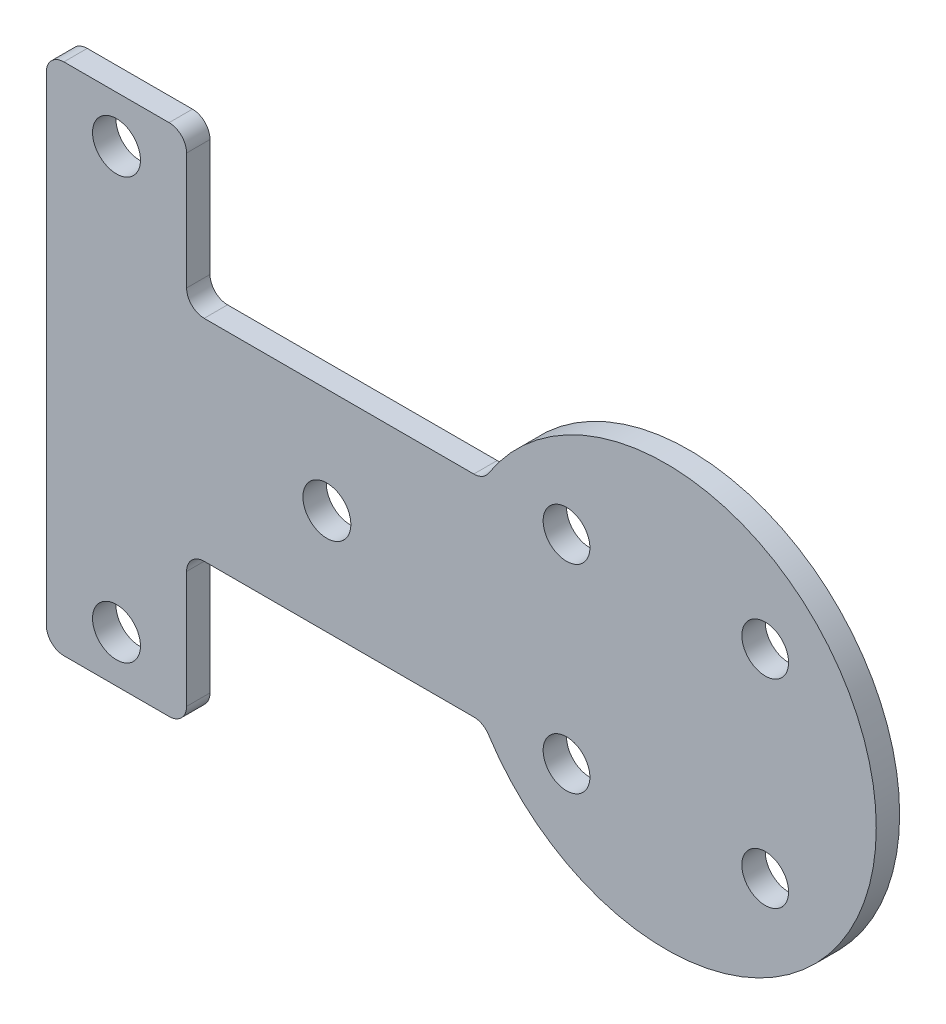
ISO-10303-21;
HEADER;
FILE_DESCRIPTION(('STEP AP214'),'2;1');
FILE_NAME('part.step','',(''),(''),'','','');
FILE_SCHEMA(('AUTOMOTIVE_DESIGN { 1 0 10303 214 1 1 1 1 }'));
ENDSEC;
DATA;
#1=APPLICATION_CONTEXT('core data for automotive mechanical design processes');
#2=APPLICATION_PROTOCOL_DEFINITION('international standard','automotive_design',2000,#1);
#3=PRODUCT_CONTEXT('',#1,'mechanical');
#4=PRODUCT('Part','Part','',(#3));
#5=PRODUCT_RELATED_PRODUCT_CATEGORY('part','',(#4));
#6=PRODUCT_DEFINITION_FORMATION('','',#4);
#7=PRODUCT_DEFINITION_CONTEXT('part definition',#1,'design');
#8=PRODUCT_DEFINITION('design','',#6,#7);
#9=PRODUCT_DEFINITION_SHAPE('','',#8);
#10=(LENGTH_UNIT() NAMED_UNIT(*) SI_UNIT(.MILLI.,.METRE.));
#11=(NAMED_UNIT(*) PLANE_ANGLE_UNIT() SI_UNIT($,.RADIAN.));
#12=(NAMED_UNIT(*) SI_UNIT($,.STERADIAN.) SOLID_ANGLE_UNIT());
#13=UNCERTAINTY_MEASURE_WITH_UNIT(LENGTH_MEASURE(1.E-05),#10,'distance_accuracy_value','');
#14=(GEOMETRIC_REPRESENTATION_CONTEXT(3) GLOBAL_UNCERTAINTY_ASSIGNED_CONTEXT((#13)) GLOBAL_UNIT_ASSIGNED_CONTEXT((#10,
#11,#12)) REPRESENTATION_CONTEXT('',''));
#15=CARTESIAN_POINT('',(0.,0.,0.));
#16=DIRECTION('',(0.,0.,1.));
#17=DIRECTION('',(1.,0.,0.));
#18=AXIS2_PLACEMENT_3D('',#15,#16,#17);
#19=CARTESIAN_POINT('',(0.,-13.3699119953848,2.));
#20=DIRECTION('',(0.,1.,0.));
#21=DIRECTION('',(0.,0.,1.));
#22=AXIS2_PLACEMENT_3D('',#19,#20,#21);
#23=PLANE('',#22);
#24=DIRECTION('',(1.,0.,0.));
#25=VECTOR('',#24,1.);
#26=CARTESIAN_POINT('',(0.,-13.3699119953848,0.));
#27=LINE('',#26,#25);
#28=CARTESIAN_POINT('',(-41.2235714285714,-13.3699119953848,0.));
#29=VERTEX_POINT('',#28);
#30=CARTESIAN_POINT('',(-18.1552481537264,-13.3699119953848,0.));
#31=VERTEX_POINT('',#30);
#32=EDGE_CURVE('E181',#29,#31,#27,.T.);
#33=ORIENTED_EDGE('',*,*,#32,.T.);
#34=DIRECTION('',(0.,0.,1.));
#35=VECTOR('',#34,1.);
#36=CARTESIAN_POINT('',(-18.1552481537264,-13.3699119953848,2.));
#37=LINE('',#36,#35);
#38=CARTESIAN_POINT('',(-18.1552481537264,-13.3699119953848,2.));
#39=VERTEX_POINT('',#38);
#40=EDGE_CURVE('E158',#31,#39,#37,.T.);
#41=ORIENTED_EDGE('',*,*,#40,.T.);
#42=DIRECTION('',(1.,0.,0.));
#43=VECTOR('',#42,1.);
#44=CARTESIAN_POINT('',(0.,-13.3699119953848,2.));
#45=LINE('',#44,#43);
#46=CARTESIAN_POINT('',(-41.2235714285714,-13.3699119953848,2.));
#47=VERTEX_POINT('',#46);
#48=EDGE_CURVE('E274',#47,#39,#45,.T.);
#49=ORIENTED_EDGE('',*,*,#48,.F.);
#50=DIRECTION('',(0.,0.,-1.));
#51=VECTOR('',#50,1.);
#52=CARTESIAN_POINT('',(-41.2235714285714,-13.3699119953848,0.));
#53=LINE('',#52,#51);
#54=EDGE_CURVE('E173',#47,#29,#53,.T.);
#55=ORIENTED_EDGE('',*,*,#54,.T.);
#56=EDGE_LOOP('',(#33,#41,#49,#55));
#57=FACE_BOUND('',#56,.T.);
#58=ADVANCED_FACE('F39',(#57),#23,.F.);
#59=CARTESIAN_POINT('',(-1.72357142857142,-4.3699119953848,2.));
#60=DIRECTION('',(0.,0.,-1.));
#61=DIRECTION('',(-1.,0.,0.));
#62=AXIS2_PLACEMENT_3D('',#59,#60,#61);
#63=CYLINDRICAL_SURFACE('',#62,18.);
#64=CARTESIAN_POINT('',(-1.72357142857142,-4.3699119953848,2.));
#65=DIRECTION('',(0.,0.,1.));
#66=DIRECTION('',(1.,0.,0.));
#67=AXIS2_PLACEMENT_3D('',#64,#65,#66);
#68=CIRCLE('',#67,18.);
#69=CARTESIAN_POINT('',(-16.8912730210222,-14.0622196876925,2.));
#70=VERTEX_POINT('',#69);
#71=CARTESIAN_POINT('',(-16.8912730210222,5.32239569692289,2.));
#72=VERTEX_POINT('',#71);
#73=EDGE_CURVE('E172',#70,#72,#68,.T.);
#74=ORIENTED_EDGE('',*,*,#73,.F.);
#75=DIRECTION('',(0.,0.,-1.));
#76=VECTOR('',#75,1.);
#77=CARTESIAN_POINT('',(-16.8912730210222,-14.0622196876925,2.));
#78=LINE('',#77,#76);
#79=CARTESIAN_POINT('',(-16.8912730210222,-14.0622196876925,0.));
#80=VERTEX_POINT('',#79);
#81=EDGE_CURVE('E157',#70,#80,#78,.T.);
#82=ORIENTED_EDGE('',*,*,#81,.T.);
#83=CARTESIAN_POINT('',(-1.72357142857142,-4.3699119953848,0.));
#84=DIRECTION('',(0.,0.,1.));
#85=DIRECTION('',(1.,0.,0.));
#86=AXIS2_PLACEMENT_3D('',#83,#84,#85);
#87=CIRCLE('',#86,18.);
#88=CARTESIAN_POINT('',(-16.8912730210222,5.32239569692289,0.));
#89=VERTEX_POINT('',#88);
#90=EDGE_CURVE('E169',#80,#89,#87,.T.);
#91=ORIENTED_EDGE('',*,*,#90,.T.);
#92=DIRECTION('',(0.,0.,-1.));
#93=VECTOR('',#92,1.);
#94=CARTESIAN_POINT('',(-16.8912730210222,5.3223956969229,2.));
#95=LINE('',#94,#93);
#96=EDGE_CURVE('E174',#89,#72,#95,.F.);
#97=ORIENTED_EDGE('',*,*,#96,.T.);
#98=EDGE_LOOP('',(#74,#82,#91,#97));
#99=FACE_BOUND('',#98,.T.);
#100=ADVANCED_FACE('F168',(#99),#63,.T.);
#101=CARTESIAN_POINT('',(0.,4.6300880046152,2.));
#102=DIRECTION('',(0.,1.,0.));
#103=DIRECTION('',(0.,0.,1.));
#104=AXIS2_PLACEMENT_3D('',#101,#102,#103);
#105=PLANE('',#104);
#106=DIRECTION('',(1.,0.,0.));
#107=VECTOR('',#106,1.);
#108=CARTESIAN_POINT('',(0.,4.6300880046152,2.));
#109=LINE('',#108,#107);
#110=CARTESIAN_POINT('',(-41.2235714285714,4.6300880046152,2.));
#111=VERTEX_POINT('',#110);
#112=CARTESIAN_POINT('',(-18.1552481537264,4.6300880046152,2.));
#113=VERTEX_POINT('',#112);
#114=EDGE_CURVE('E278',#111,#113,#109,.T.);
#115=ORIENTED_EDGE('',*,*,#114,.T.);
#116=DIRECTION('',(0.,0.,-1.));
#117=VECTOR('',#116,1.);
#118=CARTESIAN_POINT('',(-18.1552481537264,4.6300880046152,2.));
#119=LINE('',#118,#117);
#120=CARTESIAN_POINT('',(-18.1552481537264,4.6300880046152,0.));
#121=VERTEX_POINT('',#120);
#122=EDGE_CURVE('E210',#113,#121,#119,.T.);
#123=ORIENTED_EDGE('',*,*,#122,.T.);
#124=DIRECTION('',(1.,0.,0.));
#125=VECTOR('',#124,1.);
#126=CARTESIAN_POINT('',(0.,4.6300880046152,0.));
#127=LINE('',#126,#125);
#128=CARTESIAN_POINT('',(-41.2235714285714,4.6300880046152,0.));
#129=VERTEX_POINT('',#128);
#130=EDGE_CURVE('E180',#129,#121,#127,.T.);
#131=ORIENTED_EDGE('',*,*,#130,.F.);
#132=DIRECTION('',(0.,0.,-1.));
#133=VECTOR('',#132,1.);
#134=CARTESIAN_POINT('',(-41.2235714285714,4.6300880046152,2.));
#135=LINE('',#134,#133);
#136=EDGE_CURVE('E208',#129,#111,#135,.F.);
#137=ORIENTED_EDGE('',*,*,#136,.T.);
#138=EDGE_LOOP('',(#115,#123,#131,#137));
#139=FACE_BOUND('',#138,.T.);
#140=ADVANCED_FACE('F338',(#139),#105,.T.);
#141=CARTESIAN_POINT('',(-42.7235714285714,0.,2.));
#142=DIRECTION('',(-1.,0.,0.));
#143=DIRECTION('',(0.,0.,1.));
#144=AXIS2_PLACEMENT_3D('',#141,#142,#143);
#145=PLANE('',#144);
#146=DIRECTION('',(0.,1.,0.));
#147=VECTOR('',#146,1.);
#148=CARTESIAN_POINT('',(-42.7235714285714,0.,2.));
#149=LINE('',#148,#147);
#150=CARTESIAN_POINT('',(-42.7235714285714,6.1300880046152,2.));
#151=VERTEX_POINT('',#150);
#152=CARTESIAN_POINT('',(-42.7235714285714,16.1300880046152,2.));
#153=VERTEX_POINT('',#152);
#154=EDGE_CURVE('E287',#151,#153,#149,.T.);
#155=ORIENTED_EDGE('',*,*,#154,.F.);
#156=DIRECTION('',(0.,0.,-1.));
#157=VECTOR('',#156,1.);
#158=CARTESIAN_POINT('',(-42.7235714285714,6.1300880046152,2.));
#159=LINE('',#158,#157);
#160=CARTESIAN_POINT('',(-42.7235714285714,6.1300880046152,0.));
#161=VERTEX_POINT('',#160);
#162=EDGE_CURVE('E215',#151,#161,#159,.T.);
#163=ORIENTED_EDGE('',*,*,#162,.T.);
#164=DIRECTION('',(0.,1.,0.));
#165=VECTOR('',#164,1.);
#166=CARTESIAN_POINT('',(-42.7235714285714,0.,0.));
#167=LINE('',#166,#165);
#168=CARTESIAN_POINT('',(-42.7235714285714,16.1300880046152,0.));
#169=VERTEX_POINT('',#168);
#170=EDGE_CURVE('E183',#161,#169,#167,.T.);
#171=ORIENTED_EDGE('',*,*,#170,.T.);
#172=DIRECTION('',(0.,0.,-1.));
#173=VECTOR('',#172,1.);
#174=CARTESIAN_POINT('',(-42.7235714285714,16.1300880046152,2.));
#175=LINE('',#174,#173);
#176=EDGE_CURVE('E213',#169,#153,#175,.F.);
#177=ORIENTED_EDGE('',*,*,#176,.T.);
#178=EDGE_LOOP('',(#155,#163,#171,#177));
#179=FACE_BOUND('',#178,.T.);
#180=ADVANCED_FACE('F343',(#179),#145,.F.);
#181=CARTESIAN_POINT('',(0.,17.6300880046152,2.));
#182=DIRECTION('',(0.,-1.,0.));
#183=DIRECTION('',(0.,0.,-1.));
#184=AXIS2_PLACEMENT_3D('',#181,#182,#183);
#185=PLANE('',#184);
#186=DIRECTION('',(-1.,0.,0.));
#187=VECTOR('',#186,1.);
#188=CARTESIAN_POINT('',(0.,17.6300880046152,0.));
#189=LINE('',#188,#187);
#190=CARTESIAN_POINT('',(-44.2235714285714,17.6300880046152,0.));
#191=VERTEX_POINT('',#190);
#192=CARTESIAN_POINT('',(-53.2235714285714,17.6300880046152,0.));
#193=VERTEX_POINT('',#192);
#194=EDGE_CURVE('E191',#191,#193,#189,.T.);
#195=ORIENTED_EDGE('',*,*,#194,.T.);
#196=DIRECTION('',(0.,0.,-1.));
#197=VECTOR('',#196,1.);
#198=CARTESIAN_POINT('',(-53.2235714285714,17.6300880046152,2.));
#199=LINE('',#198,#197);
#200=CARTESIAN_POINT('',(-53.2235714285714,17.6300880046152,2.));
#201=VERTEX_POINT('',#200);
#202=EDGE_CURVE('E239',#193,#201,#199,.F.);
#203=ORIENTED_EDGE('',*,*,#202,.T.);
#204=DIRECTION('',(-1.,0.,0.));
#205=VECTOR('',#204,1.);
#206=CARTESIAN_POINT('',(0.,17.6300880046152,2.));
#207=LINE('',#206,#205);
#208=CARTESIAN_POINT('',(-44.2235714285714,17.6300880046152,2.));
#209=VERTEX_POINT('',#208);
#210=EDGE_CURVE('E290',#209,#201,#207,.T.);
#211=ORIENTED_EDGE('',*,*,#210,.F.);
#212=DIRECTION('',(0.,0.,-1.));
#213=VECTOR('',#212,1.);
#214=CARTESIAN_POINT('',(-44.2235714285714,17.6300880046152,2.));
#215=LINE('',#214,#213);
#216=EDGE_CURVE('E236',#209,#191,#215,.T.);
#217=ORIENTED_EDGE('',*,*,#216,.T.);
#218=EDGE_LOOP('',(#195,#203,#211,#217));
#219=FACE_BOUND('',#218,.T.);
#220=ADVANCED_FACE('F347',(#219),#185,.F.);
#221=CARTESIAN_POINT('',(-54.7235714285714,0.,2.));
#222=DIRECTION('',(1.,0.,0.));
#223=DIRECTION('',(0.,0.,-1.));
#224=AXIS2_PLACEMENT_3D('',#221,#222,#223);
#225=PLANE('',#224);
#226=DIRECTION('',(0.,-1.,0.));
#227=VECTOR('',#226,1.);
#228=CARTESIAN_POINT('',(-54.7235714285714,0.,2.));
#229=LINE('',#228,#227);
#230=CARTESIAN_POINT('',(-54.7235714285714,16.1300880046152,2.));
#231=VERTEX_POINT('',#230);
#232=CARTESIAN_POINT('',(-54.7235714285714,-24.8699119953848,2.));
#233=VERTEX_POINT('',#232);
#234=EDGE_CURVE('E292',#231,#233,#229,.T.);
#235=ORIENTED_EDGE('',*,*,#234,.F.);
#236=DIRECTION('',(0.,0.,-1.));
#237=VECTOR('',#236,1.);
#238=CARTESIAN_POINT('',(-54.7235714285714,16.1300880046152,2.));
#239=LINE('',#238,#237);
#240=CARTESIAN_POINT('',(-54.7235714285714,16.1300880046152,0.));
#241=VERTEX_POINT('',#240);
#242=EDGE_CURVE('E225',#231,#241,#239,.T.);
#243=ORIENTED_EDGE('',*,*,#242,.T.);
#244=DIRECTION('',(0.,-1.,0.));
#245=VECTOR('',#244,1.);
#246=CARTESIAN_POINT('',(-54.7235714285714,0.,0.));
#247=LINE('',#246,#245);
#248=CARTESIAN_POINT('',(-54.7235714285714,-24.8699119953848,0.));
#249=VERTEX_POINT('',#248);
#250=EDGE_CURVE('E194',#241,#249,#247,.T.);
#251=ORIENTED_EDGE('',*,*,#250,.T.);
#252=DIRECTION('',(0.,0.,-1.));
#253=VECTOR('',#252,1.);
#254=CARTESIAN_POINT('',(-54.7235714285714,-24.8699119953848,2.));
#255=LINE('',#254,#253);
#256=EDGE_CURVE('E223',#249,#233,#255,.F.);
#257=ORIENTED_EDGE('',*,*,#256,.T.);
#258=EDGE_LOOP('',(#235,#243,#251,#257));
#259=FACE_BOUND('',#258,.T.);
#260=ADVANCED_FACE('F331',(#259),#225,.F.);
#261=CARTESIAN_POINT('',(0.,-26.3699119953848,2.));
#262=DIRECTION('',(0.,1.,0.));
#263=DIRECTION('',(0.,0.,1.));
#264=AXIS2_PLACEMENT_3D('',#261,#262,#263);
#265=PLANE('',#264);
#266=DIRECTION('',(1.,0.,0.));
#267=VECTOR('',#266,1.);
#268=CARTESIAN_POINT('',(0.,-26.3699119953848,0.));
#269=LINE('',#268,#267);
#270=CARTESIAN_POINT('',(-53.2235714285714,-26.3699119953848,0.));
#271=VERTEX_POINT('',#270);
#272=CARTESIAN_POINT('',(-44.2235714285714,-26.3699119953848,0.));
#273=VERTEX_POINT('',#272);
#274=EDGE_CURVE('E197',#271,#273,#269,.T.);
#275=ORIENTED_EDGE('',*,*,#274,.T.);
#276=DIRECTION('',(0.,0.,-1.));
#277=VECTOR('',#276,1.);
#278=CARTESIAN_POINT('',(-44.2235714285714,-26.3699119953848,2.));
#279=LINE('',#278,#277);
#280=CARTESIAN_POINT('',(-44.2235714285714,-26.3699119953848,2.));
#281=VERTEX_POINT('',#280);
#282=EDGE_CURVE('E54',#273,#281,#279,.F.);
#283=ORIENTED_EDGE('',*,*,#282,.T.);
#284=DIRECTION('',(1.,0.,0.));
#285=VECTOR('',#284,1.);
#286=CARTESIAN_POINT('',(0.,-26.3699119953848,2.));
#287=LINE('',#286,#285);
#288=CARTESIAN_POINT('',(-53.2235714285714,-26.3699119953848,2.));
#289=VERTEX_POINT('',#288);
#290=EDGE_CURVE('E294',#289,#281,#287,.T.);
#291=ORIENTED_EDGE('',*,*,#290,.F.);
#292=DIRECTION('',(0.,0.,-1.));
#293=VECTOR('',#292,1.);
#294=CARTESIAN_POINT('',(-53.2235714285714,-26.3699119953848,2.));
#295=LINE('',#294,#293);
#296=EDGE_CURVE('E248',#289,#271,#295,.T.);
#297=ORIENTED_EDGE('',*,*,#296,.T.);
#298=EDGE_LOOP('',(#275,#283,#291,#297));
#299=FACE_BOUND('',#298,.T.);
#300=ADVANCED_FACE('F321',(#299),#265,.F.);
#301=CARTESIAN_POINT('',(6.77642857142867,4.1300880046151,2.));
#302=DIRECTION('',(0.,0.,-1.));
#303=DIRECTION('',(-1.,0.,0.));
#304=AXIS2_PLACEMENT_3D('',#301,#302,#303);
#305=CYLINDRICAL_SURFACE('',#304,2.);
#306=CARTESIAN_POINT('',(6.77642857142867,4.1300880046151,2.));
#307=DIRECTION('',(0.,0.,1.));
#308=DIRECTION('',(1.,0.,0.));
#309=AXIS2_PLACEMENT_3D('',#306,#307,#308);
#310=CIRCLE('',#309,2.);
#311=CARTESIAN_POINT('',(8.77642857142867,4.1300880046151,2.));
#312=VERTEX_POINT('',#311);
#313=EDGE_CURVE('E276',#312,#312,#310,.T.);
#314=ORIENTED_EDGE('',*,*,#313,.T.);
#315=EDGE_LOOP('',(#314));
#316=FACE_BOUND('',#315,.T.);
#317=CARTESIAN_POINT('',(6.77642857142867,4.1300880046151,0.));
#318=DIRECTION('',(0.,0.,1.));
#319=DIRECTION('',(1.,0.,0.));
#320=AXIS2_PLACEMENT_3D('',#317,#318,#319);
#321=CIRCLE('',#320,2.);
#322=CARTESIAN_POINT('',(8.77642857142867,4.1300880046151,0.));
#323=VERTEX_POINT('',#322);
#324=EDGE_CURVE('E185',#323,#323,#321,.T.);
#325=ORIENTED_EDGE('',*,*,#324,.F.);
#326=EDGE_LOOP('',(#325));
#327=FACE_BOUND('',#326,.T.);
#328=ADVANCED_FACE('F318',(#316,#327),#305,.F.);
#329=CARTESIAN_POINT('',(-10.2235714285713,4.13008800461526,2.));
#330=DIRECTION('',(0.,0.,-1.));
#331=DIRECTION('',(-1.,0.,0.));
#332=AXIS2_PLACEMENT_3D('',#329,#330,#331);
#333=CYLINDRICAL_SURFACE('',#332,2.);
#334=CARTESIAN_POINT('',(-10.2235714285713,4.13008800461526,2.));
#335=DIRECTION('',(0.,0.,1.));
#336=DIRECTION('',(1.,0.,0.));
#337=AXIS2_PLACEMENT_3D('',#334,#335,#336);
#338=CIRCLE('',#337,2.);
#339=CARTESIAN_POINT('',(-8.22357142857134,4.13008800461526,2.));
#340=VERTEX_POINT('',#339);
#341=EDGE_CURVE('E281',#340,#340,#338,.T.);
#342=ORIENTED_EDGE('',*,*,#341,.T.);
#343=EDGE_LOOP('',(#342));
#344=FACE_BOUND('',#343,.T.);
#345=CARTESIAN_POINT('',(-10.2235714285713,4.13008800461526,0.));
#346=DIRECTION('',(0.,0.,1.));
#347=DIRECTION('',(1.,0.,0.));
#348=AXIS2_PLACEMENT_3D('',#345,#346,#347);
#349=CIRCLE('',#348,2.);
#350=CARTESIAN_POINT('',(-8.22357142857134,4.13008800461526,0.));
#351=VERTEX_POINT('',#350);
#352=EDGE_CURVE('E312',#351,#351,#349,.T.);
#353=ORIENTED_EDGE('',*,*,#352,.F.);
#354=EDGE_LOOP('',(#353));
#355=FACE_BOUND('',#354,.T.);
#356=ADVANCED_FACE('F320',(#344,#355),#333,.F.);
#357=CARTESIAN_POINT('',(-10.2235714285714,-12.8699119953848,2.));
#358=DIRECTION('',(0.,0.,-1.));
#359=DIRECTION('',(-1.,0.,0.));
#360=AXIS2_PLACEMENT_3D('',#357,#358,#359);
#361=CYLINDRICAL_SURFACE('',#360,2.);
#362=CARTESIAN_POINT('',(-10.2235714285714,-12.8699119953848,2.));
#363=DIRECTION('',(0.,0.,1.));
#364=DIRECTION('',(1.,0.,0.));
#365=AXIS2_PLACEMENT_3D('',#362,#363,#364);
#366=CIRCLE('',#365,2.);
#367=CARTESIAN_POINT('',(-8.22357142857145,-12.8699119953848,2.));
#368=VERTEX_POINT('',#367);
#369=EDGE_CURVE('E383',#368,#368,#366,.T.);
#370=ORIENTED_EDGE('',*,*,#369,.T.);
#371=EDGE_LOOP('',(#370));
#372=FACE_BOUND('',#371,.T.);
#373=CARTESIAN_POINT('',(-10.2235714285714,-12.8699119953848,0.));
#374=DIRECTION('',(0.,0.,1.));
#375=DIRECTION('',(1.,0.,0.));
#376=AXIS2_PLACEMENT_3D('',#373,#374,#375);
#377=CIRCLE('',#376,2.);
#378=CARTESIAN_POINT('',(-8.22357142857145,-12.8699119953848,0.));
#379=VERTEX_POINT('',#378);
#380=EDGE_CURVE('E309',#379,#379,#377,.T.);
#381=ORIENTED_EDGE('',*,*,#380,.F.);
#382=EDGE_LOOP('',(#381));
#383=FACE_BOUND('',#382,.T.);
#384=ADVANCED_FACE('F328',(#372,#383),#361,.F.);
#385=CARTESIAN_POINT('',(6.77642857142857,-12.8699119953848,2.));
#386=DIRECTION('',(0.,0.,-1.));
#387=DIRECTION('',(-1.,0.,0.));
#388=AXIS2_PLACEMENT_3D('',#385,#386,#387);
#389=CYLINDRICAL_SURFACE('',#388,2.);
#390=CARTESIAN_POINT('',(6.77642857142857,-12.8699119953848,2.));
#391=DIRECTION('',(0.,0.,1.));
#392=DIRECTION('',(1.,0.,0.));
#393=AXIS2_PLACEMENT_3D('',#390,#391,#392);
#394=CIRCLE('',#393,2.);
#395=CARTESIAN_POINT('',(8.77642857142857,-12.8699119953848,2.));
#396=VERTEX_POINT('',#395);
#397=EDGE_CURVE('E379',#396,#396,#394,.T.);
#398=ORIENTED_EDGE('',*,*,#397,.T.);
#399=EDGE_LOOP('',(#398));
#400=FACE_BOUND('',#399,.T.);
#401=CARTESIAN_POINT('',(6.77642857142857,-12.8699119953848,0.));
#402=DIRECTION('',(0.,0.,1.));
#403=DIRECTION('',(1.,0.,0.));
#404=AXIS2_PLACEMENT_3D('',#401,#402,#403);
#405=CIRCLE('',#404,2.);
#406=CARTESIAN_POINT('',(8.77642857142857,-12.8699119953848,0.));
#407=VERTEX_POINT('',#406);
#408=EDGE_CURVE('E306',#407,#407,#405,.T.);
#409=ORIENTED_EDGE('',*,*,#408,.F.);
#410=EDGE_LOOP('',(#409));
#411=FACE_BOUND('',#410,.T.);
#412=ADVANCED_FACE('F412',(#400,#411),#389,.F.);
#413=CARTESIAN_POINT('',(-30.7235714285714,-4.3699119953848,2.));
#414=DIRECTION('',(0.,0.,-1.));
#415=DIRECTION('',(-1.,0.,0.));
#416=AXIS2_PLACEMENT_3D('',#413,#414,#415);
#417=CYLINDRICAL_SURFACE('',#416,2.05);
#418=CARTESIAN_POINT('',(-30.7235714285714,-4.3699119953848,2.));
#419=DIRECTION('',(0.,0.,1.));
#420=DIRECTION('',(1.,0.,0.));
#421=AXIS2_PLACEMENT_3D('',#418,#419,#420);
#422=CIRCLE('',#421,2.05);
#423=CARTESIAN_POINT('',(-28.6735714285714,-4.3699119953848,2.));
#424=VERTEX_POINT('',#423);
#425=EDGE_CURVE('E375',#424,#424,#422,.T.);
#426=ORIENTED_EDGE('',*,*,#425,.T.);
#427=EDGE_LOOP('',(#426));
#428=FACE_BOUND('',#427,.T.);
#429=CARTESIAN_POINT('',(-30.7235714285714,-4.3699119953848,0.));
#430=DIRECTION('',(0.,0.,1.));
#431=DIRECTION('',(1.,0.,0.));
#432=AXIS2_PLACEMENT_3D('',#429,#430,#431);
#433=CIRCLE('',#432,2.05);
#434=CARTESIAN_POINT('',(-28.6735714285714,-4.3699119953848,0.));
#435=VERTEX_POINT('',#434);
#436=EDGE_CURVE('E303',#435,#435,#433,.T.);
#437=ORIENTED_EDGE('',*,*,#436,.F.);
#438=EDGE_LOOP('',(#437));
#439=FACE_BOUND('',#438,.T.);
#440=ADVANCED_FACE('F397',(#428,#439),#417,.F.);
#441=CARTESIAN_POINT('',(-48.7235714285714,13.6300880046152,2.));
#442=DIRECTION('',(0.,0.,-1.));
#443=DIRECTION('',(-1.,0.,0.));
#444=AXIS2_PLACEMENT_3D('',#441,#442,#443);
#445=CYLINDRICAL_SURFACE('',#444,2.04999999999999);
#446=CARTESIAN_POINT('',(-48.7235714285714,13.6300880046152,2.));
#447=DIRECTION('',(0.,0.,1.));
#448=DIRECTION('',(1.,0.,0.));
#449=AXIS2_PLACEMENT_3D('',#446,#447,#448);
#450=CIRCLE('',#449,2.04999999999999);
#451=CARTESIAN_POINT('',(-46.6735714285714,13.6300880046152,2.));
#452=VERTEX_POINT('',#451);
#453=EDGE_CURVE('E371',#452,#452,#450,.T.);
#454=ORIENTED_EDGE('',*,*,#453,.T.);
#455=EDGE_LOOP('',(#454));
#456=FACE_BOUND('',#455,.T.);
#457=CARTESIAN_POINT('',(-48.7235714285714,13.6300880046152,0.));
#458=DIRECTION('',(0.,0.,1.));
#459=DIRECTION('',(1.,0.,0.));
#460=AXIS2_PLACEMENT_3D('',#457,#458,#459);
#461=CIRCLE('',#460,2.04999999999999);
#462=CARTESIAN_POINT('',(-46.6735714285714,13.6300880046152,0.));
#463=VERTEX_POINT('',#462);
#464=EDGE_CURVE('E300',#463,#463,#461,.T.);
#465=ORIENTED_EDGE('',*,*,#464,.F.);
#466=EDGE_LOOP('',(#465));
#467=FACE_BOUND('',#466,.T.);
#468=ADVANCED_FACE('F394',(#456,#467),#445,.F.);
#469=CARTESIAN_POINT('',(-48.7235714285714,-22.3699119953848,2.));
#470=DIRECTION('',(0.,0.,-1.));
#471=DIRECTION('',(-1.,0.,0.));
#472=AXIS2_PLACEMENT_3D('',#469,#470,#471);
#473=CYLINDRICAL_SURFACE('',#472,2.04999999999999);
#474=CARTESIAN_POINT('',(-48.7235714285714,-22.3699119953848,2.));
#475=DIRECTION('',(0.,0.,1.));
#476=DIRECTION('',(1.,0.,0.));
#477=AXIS2_PLACEMENT_3D('',#474,#475,#476);
#478=CIRCLE('',#477,2.04999999999999);
#479=CARTESIAN_POINT('',(-46.6735714285714,-22.3699119953848,2.));
#480=VERTEX_POINT('',#479);
#481=EDGE_CURVE('E202',#480,#480,#478,.F.);
#482=ORIENTED_EDGE('',*,*,#481,.F.);
#483=EDGE_LOOP('',(#482));
#484=FACE_BOUND('',#483,.T.);
#485=CARTESIAN_POINT('',(-48.7235714285714,-22.3699119953848,0.));
#486=DIRECTION('',(0.,0.,1.));
#487=DIRECTION('',(1.,0.,0.));
#488=AXIS2_PLACEMENT_3D('',#485,#486,#487);
#489=CIRCLE('',#488,2.04999999999999);
#490=CARTESIAN_POINT('',(-46.6735714285714,-22.3699119953848,0.));
#491=VERTEX_POINT('',#490);
#492=EDGE_CURVE('E297',#491,#491,#489,.F.);
#493=ORIENTED_EDGE('',*,*,#492,.T.);
#494=EDGE_LOOP('',(#493));
#495=FACE_BOUND('',#494,.T.);
#496=ADVANCED_FACE('F357',(#484,#495),#473,.F.);
#497=CARTESIAN_POINT('',(-42.7235714285714,0.,2.));
#498=DIRECTION('',(-1.,0.,0.));
#499=DIRECTION('',(0.,-1.,0.));
#500=AXIS2_PLACEMENT_3D('',#497,#498,#499);
#501=PLANE('',#500);
#502=DIRECTION('',(0.,1.,0.));
#503=VECTOR('',#502,1.);
#504=CARTESIAN_POINT('',(-42.7235714285714,0.,0.));
#505=LINE('',#504,#503);
#506=CARTESIAN_POINT('',(-42.7235714285714,-24.8699119953848,0.));
#507=VERTEX_POINT('',#506);
#508=CARTESIAN_POINT('',(-42.7235714285714,-14.8699119953848,0.));
#509=VERTEX_POINT('',#508);
#510=EDGE_CURVE('E199',#507,#509,#505,.T.);
#511=ORIENTED_EDGE('',*,*,#510,.T.);
#512=DIRECTION('',(0.,0.,-1.));
#513=VECTOR('',#512,1.);
#514=CARTESIAN_POINT('',(-42.7235714285714,-14.8699119953848,2.));
#515=LINE('',#514,#513);
#516=CARTESIAN_POINT('',(-42.7235714285714,-14.8699119953848,2.));
#517=VERTEX_POINT('',#516);
#518=EDGE_CURVE('E221',#509,#517,#515,.F.);
#519=ORIENTED_EDGE('',*,*,#518,.T.);
#520=DIRECTION('',(0.,1.,0.));
#521=VECTOR('',#520,1.);
#522=CARTESIAN_POINT('',(-42.7235714285714,0.,2.));
#523=LINE('',#522,#521);
#524=CARTESIAN_POINT('',(-42.7235714285714,-24.8699119953848,2.));
#525=VERTEX_POINT('',#524);
#526=EDGE_CURVE('E203',#525,#517,#523,.T.);
#527=ORIENTED_EDGE('',*,*,#526,.F.);
#528=DIRECTION('',(0.,0.,-1.));
#529=VECTOR('',#528,1.);
#530=CARTESIAN_POINT('',(-42.7235714285714,-24.8699119953848,2.));
#531=LINE('',#530,#529);
#532=EDGE_CURVE('E218',#525,#507,#531,.T.);
#533=ORIENTED_EDGE('',*,*,#532,.T.);
#534=EDGE_LOOP('',(#511,#519,#527,#533));
#535=FACE_BOUND('',#534,.T.);
#536=ADVANCED_FACE('F264',(#535),#501,.F.);
#537=CARTESIAN_POINT('',(0.,0.,2.));
#538=DIRECTION('',(0.,0.,1.));
#539=DIRECTION('',(1.,0.,0.));
#540=AXIS2_PLACEMENT_3D('',#537,#538,#539);
#541=PLANE('',#540);
#542=ORIENTED_EDGE('',*,*,#481,.T.);
#543=EDGE_LOOP('',(#542));
#544=FACE_BOUND('',#543,.T.);
#545=ORIENTED_EDGE('',*,*,#453,.F.);
#546=EDGE_LOOP('',(#545));
#547=FACE_BOUND('',#546,.T.);
#548=ORIENTED_EDGE('',*,*,#425,.F.);
#549=EDGE_LOOP('',(#548));
#550=FACE_BOUND('',#549,.T.);
#551=ORIENTED_EDGE('',*,*,#397,.F.);
#552=EDGE_LOOP('',(#551));
#553=FACE_BOUND('',#552,.T.);
#554=ORIENTED_EDGE('',*,*,#369,.F.);
#555=EDGE_LOOP('',(#554));
#556=FACE_BOUND('',#555,.T.);
#557=ORIENTED_EDGE('',*,*,#341,.F.);
#558=EDGE_LOOP('',(#557));
#559=FACE_BOUND('',#558,.T.);
#560=ORIENTED_EDGE('',*,*,#313,.F.);
#561=EDGE_LOOP('',(#560));
#562=FACE_BOUND('',#561,.T.);
#563=ORIENTED_EDGE('',*,*,#210,.T.);
#564=CARTESIAN_POINT('',(-53.2235714285714,16.1300880046152,2.));
#565=DIRECTION('',(0.,0.,1.));
#566=DIRECTION('',(1.,0.,0.));
#567=AXIS2_PLACEMENT_3D('',#564,#565,#566);
#568=CIRCLE('',#567,1.5);
#569=EDGE_CURVE('E246',#201,#231,#568,.T.);
#570=ORIENTED_EDGE('',*,*,#569,.T.);
#571=ORIENTED_EDGE('',*,*,#234,.T.);
#572=CARTESIAN_POINT('',(-53.2235714285714,-24.8699119953848,2.));
#573=DIRECTION('',(0.,0.,1.));
#574=DIRECTION('',(1.,0.,0.));
#575=AXIS2_PLACEMENT_3D('',#572,#573,#574);
#576=CIRCLE('',#575,1.5);
#577=EDGE_CURVE('E61',#233,#289,#576,.T.);
#578=ORIENTED_EDGE('',*,*,#577,.T.);
#579=ORIENTED_EDGE('',*,*,#290,.T.);
#580=CARTESIAN_POINT('',(-44.2235714285714,-24.8699119953848,2.));
#581=DIRECTION('',(0.,0.,1.));
#582=DIRECTION('',(1.,0.,0.));
#583=AXIS2_PLACEMENT_3D('',#580,#581,#582);
#584=CIRCLE('',#583,1.5);
#585=EDGE_CURVE('E242',#281,#525,#584,.T.);
#586=ORIENTED_EDGE('',*,*,#585,.T.);
#587=ORIENTED_EDGE('',*,*,#526,.T.);
#588=CARTESIAN_POINT('',(-41.2235714285714,-14.8699119953848,2.));
#589=DIRECTION('',(0.,0.,1.));
#590=DIRECTION('',(1.,0.,0.));
#591=AXIS2_PLACEMENT_3D('',#588,#589,#590);
#592=CIRCLE('',#591,1.5);
#593=EDGE_CURVE('E11',#517,#47,#592,.F.);
#594=ORIENTED_EDGE('',*,*,#593,.T.);
#595=ORIENTED_EDGE('',*,*,#48,.T.);
#596=CARTESIAN_POINT('',(-18.1552481537264,-14.8699119953848,2.));
#597=DIRECTION('',(0.,0.,1.));
#598=DIRECTION('',(1.,0.,0.));
#599=AXIS2_PLACEMENT_3D('',#596,#597,#598);
#600=CIRCLE('',#599,1.5);
#601=EDGE_CURVE('E163',#39,#70,#600,.F.);
#602=ORIENTED_EDGE('',*,*,#601,.T.);
#603=ORIENTED_EDGE('',*,*,#73,.T.);
#604=CARTESIAN_POINT('',(-18.1552481537264,6.1300880046152,2.));
#605=DIRECTION('',(0.,0.,1.));
#606=DIRECTION('',(1.,0.,0.));
#607=AXIS2_PLACEMENT_3D('',#604,#605,#606);
#608=CIRCLE('',#607,1.5);
#609=EDGE_CURVE('E254',#72,#113,#608,.F.);
#610=ORIENTED_EDGE('',*,*,#609,.T.);
#611=ORIENTED_EDGE('',*,*,#114,.F.);
#612=CARTESIAN_POINT('',(-41.2235714285714,6.1300880046152,2.));
#613=DIRECTION('',(0.,0.,1.));
#614=DIRECTION('',(1.,0.,0.));
#615=AXIS2_PLACEMENT_3D('',#612,#613,#614);
#616=CIRCLE('',#615,1.5);
#617=EDGE_CURVE('E258',#111,#151,#616,.F.);
#618=ORIENTED_EDGE('',*,*,#617,.T.);
#619=ORIENTED_EDGE('',*,*,#154,.T.);
#620=CARTESIAN_POINT('',(-44.2235714285714,16.1300880046152,2.));
#621=DIRECTION('',(0.,0.,1.));
#622=DIRECTION('',(1.,0.,0.));
#623=AXIS2_PLACEMENT_3D('',#620,#621,#622);
#624=CIRCLE('',#623,1.5);
#625=EDGE_CURVE('E244',#153,#209,#624,.T.);
#626=ORIENTED_EDGE('',*,*,#625,.T.);
#627=EDGE_LOOP('',(#563,#570,#571,#578,#579,#586,#587,#594,#595,#602,#603,#610,#611,#618,#619,#626));
#628=FACE_BOUND('',#627,.T.);
#629=ADVANCED_FACE('F273',(#544,#547,#550,#553,#556,#559,#562,#628),#541,.T.);
#630=CARTESIAN_POINT('',(0.,0.,0.));
#631=DIRECTION('',(0.,0.,1.));
#632=DIRECTION('',(1.,0.,0.));
#633=AXIS2_PLACEMENT_3D('',#630,#631,#632);
#634=PLANE('',#633);
#635=ORIENTED_EDGE('',*,*,#492,.F.);
#636=EDGE_LOOP('',(#635));
#637=FACE_BOUND('',#636,.T.);
#638=ORIENTED_EDGE('',*,*,#464,.T.);
#639=EDGE_LOOP('',(#638));
#640=FACE_BOUND('',#639,.T.);
#641=ORIENTED_EDGE('',*,*,#436,.T.);
#642=EDGE_LOOP('',(#641));
#643=FACE_BOUND('',#642,.T.);
#644=ORIENTED_EDGE('',*,*,#408,.T.);
#645=EDGE_LOOP('',(#644));
#646=FACE_BOUND('',#645,.T.);
#647=ORIENTED_EDGE('',*,*,#380,.T.);
#648=EDGE_LOOP('',(#647));
#649=FACE_BOUND('',#648,.T.);
#650=ORIENTED_EDGE('',*,*,#352,.T.);
#651=EDGE_LOOP('',(#650));
#652=FACE_BOUND('',#651,.T.);
#653=ORIENTED_EDGE('',*,*,#324,.T.);
#654=EDGE_LOOP('',(#653));
#655=FACE_BOUND('',#654,.T.);
#656=ORIENTED_EDGE('',*,*,#250,.F.);
#657=CARTESIAN_POINT('',(-53.2235714285714,16.1300880046152,0.));
#658=DIRECTION('',(0.,0.,1.));
#659=DIRECTION('',(1.,0.,0.));
#660=AXIS2_PLACEMENT_3D('',#657,#658,#659);
#661=CIRCLE('',#660,1.5);
#662=EDGE_CURVE('E234',#241,#193,#661,.F.);
#663=ORIENTED_EDGE('',*,*,#662,.T.);
#664=ORIENTED_EDGE('',*,*,#194,.F.);
#665=CARTESIAN_POINT('',(-44.2235714285714,16.1300880046152,0.));
#666=DIRECTION('',(0.,0.,1.));
#667=DIRECTION('',(1.,0.,0.));
#668=AXIS2_PLACEMENT_3D('',#665,#666,#667);
#669=CIRCLE('',#668,1.5);
#670=EDGE_CURVE('E232',#191,#169,#669,.F.);
#671=ORIENTED_EDGE('',*,*,#670,.T.);
#672=ORIENTED_EDGE('',*,*,#170,.F.);
#673=CARTESIAN_POINT('',(-41.2235714285714,6.1300880046152,0.));
#674=DIRECTION('',(0.,0.,1.));
#675=DIRECTION('',(1.,0.,0.));
#676=AXIS2_PLACEMENT_3D('',#673,#674,#675);
#677=CIRCLE('',#676,1.5);
#678=EDGE_CURVE('E256',#161,#129,#677,.T.);
#679=ORIENTED_EDGE('',*,*,#678,.T.);
#680=ORIENTED_EDGE('',*,*,#130,.T.);
#681=CARTESIAN_POINT('',(-18.1552481537264,6.1300880046152,0.));
#682=DIRECTION('',(0.,0.,1.));
#683=DIRECTION('',(1.,0.,0.));
#684=AXIS2_PLACEMENT_3D('',#681,#682,#683);
#685=CIRCLE('',#684,1.5);
#686=EDGE_CURVE('E179',#121,#89,#685,.T.);
#687=ORIENTED_EDGE('',*,*,#686,.T.);
#688=ORIENTED_EDGE('',*,*,#90,.F.);
#689=CARTESIAN_POINT('',(-18.1552481537264,-14.8699119953848,0.));
#690=DIRECTION('',(0.,0.,1.));
#691=DIRECTION('',(1.,0.,0.));
#692=AXIS2_PLACEMENT_3D('',#689,#690,#691);
#693=CIRCLE('',#692,1.5);
#694=EDGE_CURVE('E153',#80,#31,#693,.T.);
#695=ORIENTED_EDGE('',*,*,#694,.T.);
#696=ORIENTED_EDGE('',*,*,#32,.F.);
#697=CARTESIAN_POINT('',(-41.2235714285714,-14.8699119953848,0.));
#698=DIRECTION('',(0.,0.,1.));
#699=DIRECTION('',(1.,0.,0.));
#700=AXIS2_PLACEMENT_3D('',#697,#698,#699);
#701=CIRCLE('',#700,1.5);
#702=EDGE_CURVE('E47',#29,#509,#701,.T.);
#703=ORIENTED_EDGE('',*,*,#702,.T.);
#704=ORIENTED_EDGE('',*,*,#510,.F.);
#705=CARTESIAN_POINT('',(-44.2235714285714,-24.8699119953848,0.));
#706=DIRECTION('',(0.,0.,1.));
#707=DIRECTION('',(1.,0.,0.));
#708=AXIS2_PLACEMENT_3D('',#705,#706,#707);
#709=CIRCLE('',#708,1.5);
#710=EDGE_CURVE('E230',#507,#273,#709,.F.);
#711=ORIENTED_EDGE('',*,*,#710,.T.);
#712=ORIENTED_EDGE('',*,*,#274,.F.);
#713=CARTESIAN_POINT('',(-53.2235714285714,-24.8699119953848,0.));
#714=DIRECTION('',(0.,0.,1.));
#715=DIRECTION('',(1.,0.,0.));
#716=AXIS2_PLACEMENT_3D('',#713,#714,#715);
#717=CIRCLE('',#716,1.5);
#718=EDGE_CURVE('E228',#271,#249,#717,.F.);
#719=ORIENTED_EDGE('',*,*,#718,.T.);
#720=EDGE_LOOP('',(#656,#663,#664,#671,#672,#679,#680,#687,#688,#695,#696,#703,#704,#711,#712,#719));
#721=FACE_BOUND('',#720,.T.);
#722=ADVANCED_FACE('F177',(#637,#640,#643,#646,#649,#652,#655,#721),#634,.F.);
#723=CARTESIAN_POINT('',(-18.1552481537264,-14.8699119953848,2.));
#724=DIRECTION('',(0.,0.,-1.));
#725=DIRECTION('',(-1.,0.,0.));
#726=AXIS2_PLACEMENT_3D('',#723,#724,#725);
#727=CYLINDRICAL_SURFACE('',#726,1.5);
#728=ORIENTED_EDGE('',*,*,#601,.F.);
#729=ORIENTED_EDGE('',*,*,#40,.F.);
#730=ORIENTED_EDGE('',*,*,#694,.F.);
#731=ORIENTED_EDGE('',*,*,#81,.F.);
#732=EDGE_LOOP('',(#728,#729,#730,#731));
#733=FACE_BOUND('',#732,.T.);
#734=ADVANCED_FACE('F156',(#733),#727,.F.);
#735=CARTESIAN_POINT('',(-18.1552481537264,6.1300880046152,2.));
#736=DIRECTION('',(0.,0.,-1.));
#737=DIRECTION('',(-1.,0.,0.));
#738=AXIS2_PLACEMENT_3D('',#735,#736,#737);
#739=CYLINDRICAL_SURFACE('',#738,1.5);
#740=ORIENTED_EDGE('',*,*,#609,.F.);
#741=ORIENTED_EDGE('',*,*,#96,.F.);
#742=ORIENTED_EDGE('',*,*,#686,.F.);
#743=ORIENTED_EDGE('',*,*,#122,.F.);
#744=EDGE_LOOP('',(#740,#741,#742,#743));
#745=FACE_BOUND('',#744,.T.);
#746=ADVANCED_FACE('F429',(#745),#739,.F.);
#747=CARTESIAN_POINT('',(-41.2235714285714,6.1300880046152,2.));
#748=DIRECTION('',(0.,0.,-1.));
#749=DIRECTION('',(-1.,0.,0.));
#750=AXIS2_PLACEMENT_3D('',#747,#748,#749);
#751=CYLINDRICAL_SURFACE('',#750,1.5);
#752=ORIENTED_EDGE('',*,*,#617,.F.);
#753=ORIENTED_EDGE('',*,*,#136,.F.);
#754=ORIENTED_EDGE('',*,*,#678,.F.);
#755=ORIENTED_EDGE('',*,*,#162,.F.);
#756=EDGE_LOOP('',(#752,#753,#754,#755));
#757=FACE_BOUND('',#756,.T.);
#758=ADVANCED_FACE('F432',(#757),#751,.F.);
#759=CARTESIAN_POINT('',(-41.2235714285714,-14.8699119953848,2.));
#760=DIRECTION('',(0.,0.,1.));
#761=DIRECTION('',(1.,0.,0.));
#762=AXIS2_PLACEMENT_3D('',#759,#760,#761);
#763=CYLINDRICAL_SURFACE('',#762,1.5);
#764=ORIENTED_EDGE('',*,*,#593,.F.);
#765=ORIENTED_EDGE('',*,*,#518,.F.);
#766=ORIENTED_EDGE('',*,*,#702,.F.);
#767=ORIENTED_EDGE('',*,*,#54,.F.);
#768=EDGE_LOOP('',(#764,#765,#766,#767));
#769=FACE_BOUND('',#768,.T.);
#770=ADVANCED_FACE('F269',(#769),#763,.F.);
#771=CARTESIAN_POINT('',(-53.2235714285714,16.1300880046152,2.));
#772=DIRECTION('',(0.,0.,-1.));
#773=DIRECTION('',(-1.,0.,0.));
#774=AXIS2_PLACEMENT_3D('',#771,#772,#773);
#775=CYLINDRICAL_SURFACE('',#774,1.5);
#776=ORIENTED_EDGE('',*,*,#569,.F.);
#777=ORIENTED_EDGE('',*,*,#202,.F.);
#778=ORIENTED_EDGE('',*,*,#662,.F.);
#779=ORIENTED_EDGE('',*,*,#242,.F.);
#780=EDGE_LOOP('',(#776,#777,#778,#779));
#781=FACE_BOUND('',#780,.T.);
#782=ADVANCED_FACE('F439',(#781),#775,.T.);
#783=CARTESIAN_POINT('',(-44.2235714285714,16.1300880046152,2.));
#784=DIRECTION('',(0.,0.,-1.));
#785=DIRECTION('',(-1.,0.,0.));
#786=AXIS2_PLACEMENT_3D('',#783,#784,#785);
#787=CYLINDRICAL_SURFACE('',#786,1.5);
#788=ORIENTED_EDGE('',*,*,#625,.F.);
#789=ORIENTED_EDGE('',*,*,#176,.F.);
#790=ORIENTED_EDGE('',*,*,#670,.F.);
#791=ORIENTED_EDGE('',*,*,#216,.F.);
#792=EDGE_LOOP('',(#788,#789,#790,#791));
#793=FACE_BOUND('',#792,.T.);
#794=ADVANCED_FACE('F442',(#793),#787,.T.);
#795=CARTESIAN_POINT('',(-44.2235714285714,-24.8699119953848,2.));
#796=DIRECTION('',(0.,0.,-1.));
#797=DIRECTION('',(-1.,0.,0.));
#798=AXIS2_PLACEMENT_3D('',#795,#796,#797);
#799=CYLINDRICAL_SURFACE('',#798,1.5);
#800=ORIENTED_EDGE('',*,*,#585,.F.);
#801=ORIENTED_EDGE('',*,*,#282,.F.);
#802=ORIENTED_EDGE('',*,*,#710,.F.);
#803=ORIENTED_EDGE('',*,*,#532,.F.);
#804=EDGE_LOOP('',(#800,#801,#802,#803));
#805=FACE_BOUND('',#804,.T.);
#806=ADVANCED_FACE('F445',(#805),#799,.T.);
#807=CARTESIAN_POINT('',(-53.2235714285714,-24.8699119953848,2.));
#808=DIRECTION('',(0.,0.,-1.));
#809=DIRECTION('',(-1.,0.,0.));
#810=AXIS2_PLACEMENT_3D('',#807,#808,#809);
#811=CYLINDRICAL_SURFACE('',#810,1.5);
#812=ORIENTED_EDGE('',*,*,#577,.F.);
#813=ORIENTED_EDGE('',*,*,#256,.F.);
#814=ORIENTED_EDGE('',*,*,#718,.F.);
#815=ORIENTED_EDGE('',*,*,#296,.F.);
#816=EDGE_LOOP('',(#812,#813,#814,#815));
#817=FACE_BOUND('',#816,.T.);
#818=ADVANCED_FACE('F41',(#817),#811,.T.);
#819=CLOSED_SHELL('',(#58,#100,#140,#180,#220,#260,#300,#328,#356,#384,#412,#440,#468,#496,#536,
#629,#722,#734,#746,#758,#770,#782,#794,#806,#818));
#820=MANIFOLD_SOLID_BREP('B2',#819);
#821=ADVANCED_BREP_SHAPE_REPRESENTATION('',(#18,#820),#14);
#822=SHAPE_DEFINITION_REPRESENTATION(#9,#821);
ENDSEC;
END-ISO-10303-21;
